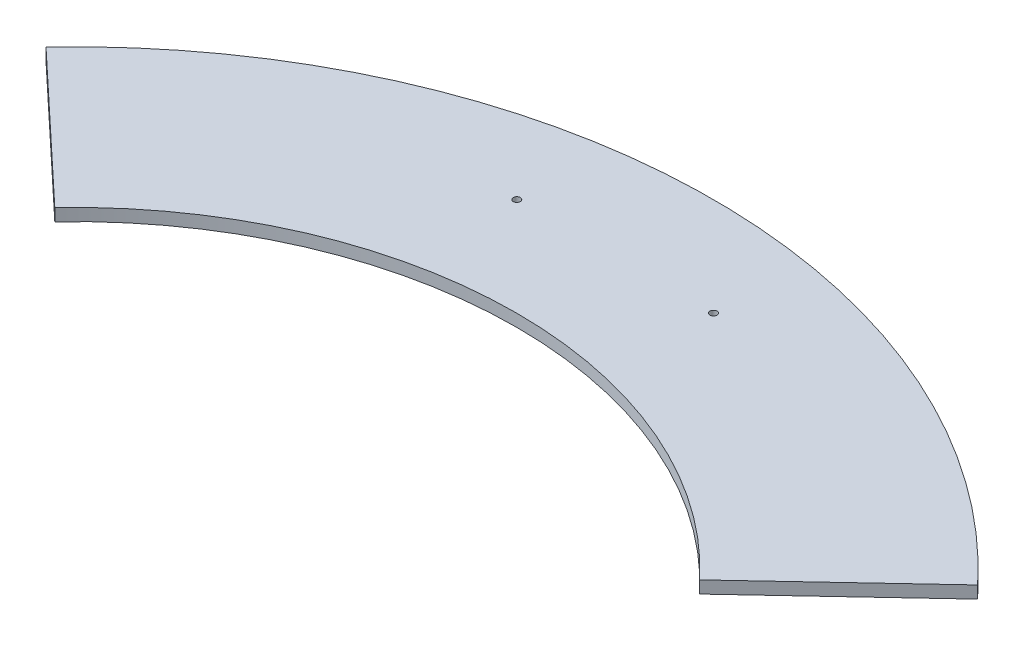
ISO-10303-21;
HEADER;
FILE_DESCRIPTION(('STEP AP214'),'2;1');
FILE_NAME('part.step','',(''),(''),'','','');
FILE_SCHEMA(('AUTOMOTIVE_DESIGN { 1 0 10303 214 1 1 1 1 }'));
ENDSEC;
DATA;
#1=APPLICATION_CONTEXT('core data for automotive mechanical design processes');
#2=APPLICATION_PROTOCOL_DEFINITION('international standard','automotive_design',2000,#1);
#3=PRODUCT_CONTEXT('',#1,'mechanical');
#4=PRODUCT('Part','Part','',(#3));
#5=PRODUCT_RELATED_PRODUCT_CATEGORY('part','',(#4));
#6=PRODUCT_DEFINITION_FORMATION('','',#4);
#7=PRODUCT_DEFINITION_CONTEXT('part definition',#1,'design');
#8=PRODUCT_DEFINITION('design','',#6,#7);
#9=PRODUCT_DEFINITION_SHAPE('','',#8);
#10=(LENGTH_UNIT() NAMED_UNIT(*) SI_UNIT(.MILLI.,.METRE.));
#11=(NAMED_UNIT(*) PLANE_ANGLE_UNIT() SI_UNIT($,.RADIAN.));
#12=(NAMED_UNIT(*) SI_UNIT($,.STERADIAN.) SOLID_ANGLE_UNIT());
#13=UNCERTAINTY_MEASURE_WITH_UNIT(LENGTH_MEASURE(1.E-05),#10,'distance_accuracy_value','');
#14=(GEOMETRIC_REPRESENTATION_CONTEXT(3) GLOBAL_UNCERTAINTY_ASSIGNED_CONTEXT((#13)) GLOBAL_UNIT_ASSIGNED_CONTEXT((#10,
#11,#12)) REPRESENTATION_CONTEXT('',''));
#15=CARTESIAN_POINT('',(0.,0.,0.));
#16=DIRECTION('',(0.,0.,1.));
#17=DIRECTION('',(1.,0.,0.));
#18=AXIS2_PLACEMENT_3D('',#15,#16,#17);
#19=CARTESIAN_POINT('',(0.,6.35,25.4));
#20=DIRECTION('',(0.,-1.,0.));
#21=DIRECTION('',(0.,0.,-1.));
#22=AXIS2_PLACEMENT_3D('',#19,#20,#21);
#23=CYLINDRICAL_SURFACE('',#22,329.946);
#24=CARTESIAN_POINT('',(0.,0.,25.4));
#25=DIRECTION('',(0.,1.,0.));
#26=DIRECTION('',(0.,0.,-1.));
#27=AXIS2_PLACEMENT_3D('',#24,#25,#26);
#28=CIRCLE('',#27,329.946);
#29=CARTESIAN_POINT('',(240.574340443864,0.,-200.406));
#30=VERTEX_POINT('',#29);
#31=CARTESIAN_POINT('',(-240.574340443864,0.,-200.406));
#32=VERTEX_POINT('',#31);
#33=EDGE_CURVE('E99',#30,#32,#28,.T.);
#34=ORIENTED_EDGE('',*,*,#33,.T.);
#35=DIRECTION('',(0.,-1.,0.));
#36=VECTOR('',#35,1.);
#37=CARTESIAN_POINT('',(-240.574340443864,6.35,-200.406));
#38=LINE('',#37,#36);
#39=CARTESIAN_POINT('',(-240.574340443864,6.35,-200.406));
#40=VERTEX_POINT('',#39);
#41=EDGE_CURVE('E11',#40,#32,#38,.T.);
#42=ORIENTED_EDGE('',*,*,#41,.F.);
#43=CARTESIAN_POINT('',(0.,6.35,25.4));
#44=DIRECTION('',(0.,1.,0.));
#45=DIRECTION('',(0.,0.,-1.));
#46=AXIS2_PLACEMENT_3D('',#43,#44,#45);
#47=CIRCLE('',#46,329.946);
#48=CARTESIAN_POINT('',(240.574340443864,6.35,-200.406));
#49=VERTEX_POINT('',#48);
#50=EDGE_CURVE('E86',#49,#40,#47,.T.);
#51=ORIENTED_EDGE('',*,*,#50,.F.);
#52=DIRECTION('',(0.,-1.,0.));
#53=VECTOR('',#52,1.);
#54=CARTESIAN_POINT('',(240.574340443864,6.35,-200.406));
#55=LINE('',#54,#53);
#56=EDGE_CURVE('E95',#49,#30,#55,.T.);
#57=ORIENTED_EDGE('',*,*,#56,.T.);
#58=EDGE_LOOP('',(#34,#42,#51,#57));
#59=FACE_BOUND('',#58,.T.);
#60=ADVANCED_FACE('F33',(#59),#23,.T.);
#61=CARTESIAN_POINT('',(-166.494481954606,6.35,-130.873744418784));
#62=DIRECTION('',(0.684372594303311,0.,-0.729132465445447));
#63=DIRECTION('',(-0.729132465445447,0.,-0.684372594303311));
#64=AXIS2_PLACEMENT_3D('',#61,#62,#63);
#65=PLANE('',#64);
#66=DIRECTION('',(0.729132465445447,0.,0.684372594303311));
#67=VECTOR('',#66,1.);
#68=CARTESIAN_POINT('',(-166.494481954606,0.,-130.873744418784));
#69=LINE('',#68,#67);
#70=CARTESIAN_POINT('',(-166.494481954606,0.,-130.873744418784));
#71=VERTEX_POINT('',#70);
#72=EDGE_CURVE('E90',#32,#71,#69,.T.);
#73=ORIENTED_EDGE('',*,*,#72,.T.);
#74=DIRECTION('',(0.,-1.,0.));
#75=VECTOR('',#74,1.);
#76=CARTESIAN_POINT('',(-166.494481954606,6.35,-130.873744418784));
#77=LINE('',#76,#75);
#78=CARTESIAN_POINT('',(-166.494481954606,6.35,-130.873744418784));
#79=VERTEX_POINT('',#78);
#80=EDGE_CURVE('E42',#79,#71,#77,.T.);
#81=ORIENTED_EDGE('',*,*,#80,.F.);
#82=DIRECTION('',(0.729132465445447,0.,0.684372594303311));
#83=VECTOR('',#82,1.);
#84=CARTESIAN_POINT('',(-166.494481954606,6.35,-130.873744418784));
#85=LINE('',#84,#83);
#86=EDGE_CURVE('E81',#40,#79,#85,.T.);
#87=ORIENTED_EDGE('',*,*,#86,.F.);
#88=ORIENTED_EDGE('',*,*,#41,.T.);
#89=EDGE_LOOP('',(#73,#81,#87,#88));
#90=FACE_BOUND('',#89,.T.);
#91=ADVANCED_FACE('F89',(#90),#65,.F.);
#92=CARTESIAN_POINT('',(0.,6.35,25.4));
#93=DIRECTION('',(0.,-1.,0.));
#94=DIRECTION('',(0.,0.,-1.));
#95=AXIS2_PLACEMENT_3D('',#92,#93,#94);
#96=CYLINDRICAL_SURFACE('',#95,228.346);
#97=CARTESIAN_POINT('',(0.,0.,25.4));
#98=DIRECTION('',(0.,-1.,0.));
#99=DIRECTION('',(0.,0.,-1.));
#100=AXIS2_PLACEMENT_3D('',#97,#98,#99);
#101=CIRCLE('',#100,228.346);
#102=CARTESIAN_POINT('',(166.494481954606,0.,-130.873744418784));
#103=VERTEX_POINT('',#102);
#104=EDGE_CURVE('E68',#71,#103,#101,.T.);
#105=ORIENTED_EDGE('',*,*,#104,.T.);
#106=DIRECTION('',(0.,-1.,0.));
#107=VECTOR('',#106,1.);
#108=CARTESIAN_POINT('',(166.494481954606,6.35,-130.873744418784));
#109=LINE('',#108,#107);
#110=CARTESIAN_POINT('',(166.494481954606,6.35,-130.873744418784));
#111=VERTEX_POINT('',#110);
#112=EDGE_CURVE('E91',#111,#103,#109,.T.);
#113=ORIENTED_EDGE('',*,*,#112,.F.);
#114=CARTESIAN_POINT('',(0.,6.35,25.4));
#115=DIRECTION('',(0.,-1.,0.));
#116=DIRECTION('',(0.,0.,-1.));
#117=AXIS2_PLACEMENT_3D('',#114,#115,#116);
#118=CIRCLE('',#117,228.346);
#119=EDGE_CURVE('E84',#79,#111,#118,.T.);
#120=ORIENTED_EDGE('',*,*,#119,.F.);
#121=ORIENTED_EDGE('',*,*,#80,.T.);
#122=EDGE_LOOP('',(#105,#113,#120,#121));
#123=FACE_BOUND('',#122,.T.);
#124=ADVANCED_FACE('F93',(#123),#96,.F.);
#125=CARTESIAN_POINT('',(166.494481954606,6.35,-130.873744418784));
#126=DIRECTION('',(-0.68437259430331,0.,-0.729132465445448));
#127=DIRECTION('',(-0.729132465445448,0.,0.68437259430331));
#128=AXIS2_PLACEMENT_3D('',#125,#126,#127);
#129=PLANE('',#128);
#130=DIRECTION('',(0.729132465445448,0.,-0.68437259430331));
#131=VECTOR('',#130,1.);
#132=CARTESIAN_POINT('',(166.494481954606,0.,-130.873744418784));
#133=LINE('',#132,#131);
#134=EDGE_CURVE('E74',#103,#30,#133,.T.);
#135=ORIENTED_EDGE('',*,*,#134,.T.);
#136=ORIENTED_EDGE('',*,*,#56,.F.);
#137=DIRECTION('',(0.729132465445448,0.,-0.68437259430331));
#138=VECTOR('',#137,1.);
#139=CARTESIAN_POINT('',(166.494481954606,6.35,-130.873744418784));
#140=LINE('',#139,#138);
#141=EDGE_CURVE('E51',#111,#49,#140,.T.);
#142=ORIENTED_EDGE('',*,*,#141,.F.);
#143=ORIENTED_EDGE('',*,*,#112,.T.);
#144=EDGE_LOOP('',(#135,#136,#142,#143));
#145=FACE_BOUND('',#144,.T.);
#146=ADVANCED_FACE('F126',(#145),#129,.F.);
#147=CARTESIAN_POINT('',(0.,6.35,25.4));
#148=DIRECTION('',(0.,-1.,0.));
#149=DIRECTION('',(0.,0.,-1.));
#150=AXIS2_PLACEMENT_3D('',#147,#148,#149);
#151=PLANE('',#150);
#152=CARTESIAN_POINT('',(-50.8,6.35,-253.746255928505));
#153=DIRECTION('',(0.,1.,0.));
#154=DIRECTION('',(0.,0.,1.));
#155=AXIS2_PLACEMENT_3D('',#152,#153,#154);
#156=CIRCLE('',#155,1.82879999999999);
#157=CARTESIAN_POINT('',(-50.8,6.35,-251.917455928505));
#158=VERTEX_POINT('',#157);
#159=EDGE_CURVE('E116',#158,#158,#156,.T.);
#160=ORIENTED_EDGE('',*,*,#159,.F.);
#161=EDGE_LOOP('',(#160));
#162=FACE_BOUND('',#161,.T.);
#163=CARTESIAN_POINT('',(50.8,6.35,-253.746255928505));
#164=DIRECTION('',(0.,1.,0.));
#165=DIRECTION('',(0.,0.,1.));
#166=AXIS2_PLACEMENT_3D('',#163,#164,#165);
#167=CIRCLE('',#166,1.82879999999999);
#168=CARTESIAN_POINT('',(50.8,6.35,-251.917455928505));
#169=VERTEX_POINT('',#168);
#170=EDGE_CURVE('E108',#169,#169,#167,.T.);
#171=ORIENTED_EDGE('',*,*,#170,.F.);
#172=EDGE_LOOP('',(#171));
#173=FACE_BOUND('',#172,.T.);
#174=ORIENTED_EDGE('',*,*,#50,.T.);
#175=ORIENTED_EDGE('',*,*,#86,.T.);
#176=ORIENTED_EDGE('',*,*,#119,.T.);
#177=ORIENTED_EDGE('',*,*,#141,.T.);
#178=EDGE_LOOP('',(#174,#175,#176,#177));
#179=FACE_BOUND('',#178,.T.);
#180=ADVANCED_FACE('F82',(#162,#173,#179),#151,.F.);
#181=CARTESIAN_POINT('',(0.,0.,25.4));
#182=DIRECTION('',(0.,-1.,0.));
#183=DIRECTION('',(0.,0.,-1.));
#184=AXIS2_PLACEMENT_3D('',#181,#182,#183);
#185=PLANE('',#184);
#186=CARTESIAN_POINT('',(-50.8,0.,-253.746255928505));
#187=DIRECTION('',(0.,-1.,0.));
#188=DIRECTION('',(0.,0.,-1.));
#189=AXIS2_PLACEMENT_3D('',#186,#187,#188);
#190=CIRCLE('',#189,1.8288);
#191=CARTESIAN_POINT('',(-50.8,0.,-255.575055928505));
#192=VERTEX_POINT('',#191);
#193=EDGE_CURVE('E36',#192,#192,#190,.T.);
#194=ORIENTED_EDGE('',*,*,#193,.F.);
#195=EDGE_LOOP('',(#194));
#196=FACE_BOUND('',#195,.T.);
#197=CARTESIAN_POINT('',(50.8,0.,-253.746255928505));
#198=DIRECTION('',(0.,-1.,0.));
#199=DIRECTION('',(0.,0.,-1.));
#200=AXIS2_PLACEMENT_3D('',#197,#198,#199);
#201=CIRCLE('',#200,1.8288);
#202=CARTESIAN_POINT('',(50.8,0.,-255.575055928505));
#203=VERTEX_POINT('',#202);
#204=EDGE_CURVE('E102',#203,#203,#201,.T.);
#205=ORIENTED_EDGE('',*,*,#204,.F.);
#206=EDGE_LOOP('',(#205));
#207=FACE_BOUND('',#206,.T.);
#208=ORIENTED_EDGE('',*,*,#33,.F.);
#209=ORIENTED_EDGE('',*,*,#134,.F.);
#210=ORIENTED_EDGE('',*,*,#104,.F.);
#211=ORIENTED_EDGE('',*,*,#72,.F.);
#212=EDGE_LOOP('',(#208,#209,#210,#211));
#213=FACE_BOUND('',#212,.T.);
#214=ADVANCED_FACE('F125',(#196,#207,#213),#185,.T.);
#215=CARTESIAN_POINT('',(50.8,6.35,-253.746255928505));
#216=DIRECTION('',(0.,1.,0.));
#217=DIRECTION('',(0.,0.,1.));
#218=AXIS2_PLACEMENT_3D('',#215,#216,#217);
#219=CYLINDRICAL_SURFACE('',#218,1.8288);
#220=ORIENTED_EDGE('',*,*,#204,.T.);
#221=EDGE_LOOP('',(#220));
#222=FACE_BOUND('',#221,.T.);
#223=ORIENTED_EDGE('',*,*,#170,.T.);
#224=EDGE_LOOP('',(#223));
#225=FACE_BOUND('',#224,.T.);
#226=ADVANCED_FACE('F132',(#222,#225),#219,.F.);
#227=CARTESIAN_POINT('',(-50.8,6.35,-253.746255928505));
#228=DIRECTION('',(0.,1.,0.));
#229=DIRECTION('',(0.,0.,1.));
#230=AXIS2_PLACEMENT_3D('',#227,#228,#229);
#231=CYLINDRICAL_SURFACE('',#230,1.8288);
#232=ORIENTED_EDGE('',*,*,#193,.T.);
#233=EDGE_LOOP('',(#232));
#234=FACE_BOUND('',#233,.T.);
#235=ORIENTED_EDGE('',*,*,#159,.T.);
#236=EDGE_LOOP('',(#235));
#237=FACE_BOUND('',#236,.T.);
#238=ADVANCED_FACE('F121',(#234,#237),#231,.F.);
#239=CLOSED_SHELL('',(#60,#91,#124,#146,#180,#214,#226,#238));
#240=MANIFOLD_SOLID_BREP('B2',#239);
#241=ADVANCED_BREP_SHAPE_REPRESENTATION('',(#18,#240),#14);
#242=SHAPE_DEFINITION_REPRESENTATION(#9,#241);
ENDSEC;
END-ISO-10303-21;
